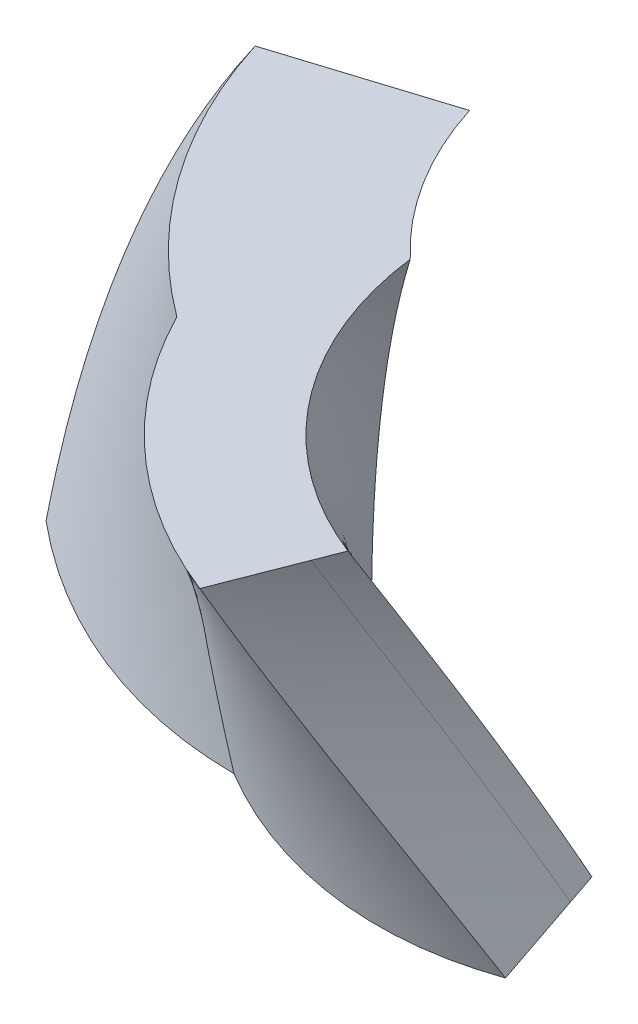
ISO-10303-21;
HEADER;
FILE_DESCRIPTION(('STEP AP214'),'2;1');
FILE_NAME('part.step','',(''),(''),'','','');
FILE_SCHEMA(('AUTOMOTIVE_DESIGN { 1 0 10303 214 1 1 1 1 }'));
ENDSEC;
DATA;
#1=APPLICATION_CONTEXT('core data for automotive mechanical design processes');
#2=APPLICATION_PROTOCOL_DEFINITION('international standard','automotive_design',2000,#1);
#3=PRODUCT_CONTEXT('',#1,'mechanical');
#4=PRODUCT('Part','Part','',(#3));
#5=PRODUCT_RELATED_PRODUCT_CATEGORY('part','',(#4));
#6=PRODUCT_DEFINITION_FORMATION('','',#4);
#7=PRODUCT_DEFINITION_CONTEXT('part definition',#1,'design');
#8=PRODUCT_DEFINITION('design','',#6,#7);
#9=PRODUCT_DEFINITION_SHAPE('','',#8);
#10=(LENGTH_UNIT() NAMED_UNIT(*) SI_UNIT(.MILLI.,.METRE.));
#11=(NAMED_UNIT(*) PLANE_ANGLE_UNIT() SI_UNIT($,.RADIAN.));
#12=(NAMED_UNIT(*) SI_UNIT($,.STERADIAN.) SOLID_ANGLE_UNIT());
#13=UNCERTAINTY_MEASURE_WITH_UNIT(LENGTH_MEASURE(1.E-05),#10,'distance_accuracy_value','');
#14=(GEOMETRIC_REPRESENTATION_CONTEXT(3) GLOBAL_UNCERTAINTY_ASSIGNED_CONTEXT((#13)) GLOBAL_UNIT_ASSIGNED_CONTEXT((#10,
#11,#12)) REPRESENTATION_CONTEXT('',''));
#15=CARTESIAN_POINT('',(0.,0.,0.));
#16=DIRECTION('',(0.,0.,1.));
#17=DIRECTION('',(1.,0.,0.));
#18=AXIS2_PLACEMENT_3D('',#15,#16,#17);
#19=CARTESIAN_POINT('',(15.,93.832,-10.));
#20=DIRECTION('',(0.,1.,0.));
#21=DIRECTION('',(0.,0.,1.));
#22=AXIS2_PLACEMENT_3D('',#19,#20,#21);
#23=PLANE('',#22);
#24=CARTESIAN_POINT('',(15.,93.832,-10.));
#25=DIRECTION('',(0.,-1.,0.));
#26=DIRECTION('',(0.,0.,1.));
#27=AXIS2_PLACEMENT_3D('',#24,#25,#26);
#28=CIRCLE('',#27,104.5);
#29=CARTESIAN_POINT('',(-56.8358537725828,93.832,65.8937422503601));
#30=VERTEX_POINT('',#29);
#31=CARTESIAN_POINT('',(-84.6707772418455,93.832,21.4004166215421));
#32=VERTEX_POINT('',#31);
#33=EDGE_CURVE('E84',#30,#32,#28,.T.);
#34=ORIENTED_EDGE('',*,*,#33,.T.);
#35=DIRECTION('',(-0.953787342027228,0.,0.30048245570854));
#36=VECTOR('',#35,1.);
#37=CARTESIAN_POINT('',(-92.3010759780632,93.832,23.8042762672104));
#38=LINE('',#37,#36);
#39=CARTESIAN_POINT('',(-92.3010759780632,93.832,23.8042762672104));
#40=VERTEX_POINT('',#39);
#41=EDGE_CURVE('E79',#32,#40,#38,.T.);
#42=ORIENTED_EDGE('',*,*,#41,.T.);
#43=DIRECTION('',(-0.953787342027229,0.,0.300482455708537));
#44=VECTOR('',#43,1.);
#45=CARTESIAN_POINT('',(-130.452569659153,93.832,35.823574495552));
#46=LINE('',#45,#44);
#47=CARTESIAN_POINT('',(-130.452569659153,93.832,35.8235744955519));
#48=VERTEX_POINT('',#47);
#49=EDGE_CURVE('E73',#40,#48,#46,.T.);
#50=ORIENTED_EDGE('',*,*,#49,.T.);
#51=CARTESIAN_POINT('',(15.,93.832,-10.));
#52=DIRECTION('',(0.,1.,0.));
#53=DIRECTION('',(0.,0.,1.));
#54=AXIS2_PLACEMENT_3D('',#51,#52,#53);
#55=CIRCLE('',#54,152.5);
#56=CARTESIAN_POINT('',(-75.5466634875456,93.832,112.709216162737));
#57=VERTEX_POINT('',#56);
#58=EDGE_CURVE('E114',#48,#57,#55,.T.);
#59=ORIENTED_EDGE('',*,*,#58,.T.);
#60=CARTESIAN_POINT('',(41.3342929723728,93.832,53.4084346384661));
#61=DIRECTION('',(0.,1.,0.));
#62=DIRECTION('',(0.,0.,1.));
#63=AXIS2_PLACEMENT_3D('',#60,#61,#62);
#64=CIRCLE('',#63,131.06388012101);
#65=CARTESIAN_POINT('',(-6.27577924360034,93.832,175.519129075786));
#66=VERTEX_POINT('',#65);
#67=EDGE_CURVE('E120',#57,#66,#64,.T.);
#68=ORIENTED_EDGE('',*,*,#67,.T.);
#69=DIRECTION('',(0.363258528375743,0.,-0.931688382219232));
#70=VECTOR('',#69,1.);
#71=CARTESIAN_POINT('',(2.47983221247586,93.832,153.062666706335));
#72=LINE('',#71,#70);
#73=CARTESIAN_POINT('',(2.47983221247586,93.832,153.062666706335));
#74=VERTEX_POINT('',#73);
#75=EDGE_CURVE('E131',#66,#74,#72,.T.);
#76=ORIENTED_EDGE('',*,*,#75,.T.);
#77=DIRECTION('',(0.363258528375739,0.,-0.931688382219233));
#78=VECTOR('',#77,1.);
#79=CARTESIAN_POINT('',(2.47983221247586,93.832,153.062666706335));
#80=LINE('',#79,#78);
#81=CARTESIAN_POINT('',(5.38590043948178,93.832,145.609159648582));
#82=VERTEX_POINT('',#81);
#83=EDGE_CURVE('E136',#74,#82,#80,.T.);
#84=ORIENTED_EDGE('',*,*,#83,.T.);
#85=CARTESIAN_POINT('',(41.3342929723728,93.832,53.4084346384661));
#86=DIRECTION('',(0.,-1.,0.));
#87=DIRECTION('',(0.,0.,1.));
#88=AXIS2_PLACEMENT_3D('',#85,#86,#87);
#89=CIRCLE('',#88,98.9609044930863);
#90=EDGE_CURVE('E150',#82,#30,#89,.T.);
#91=ORIENTED_EDGE('',*,*,#90,.T.);
#92=EDGE_LOOP('',(#34,#42,#50,#59,#68,#76,#84,#91));
#93=FACE_BOUND('',#92,.T.);
#94=ADVANCED_FACE('F33',(#93),#23,.T.);
#95=CARTESIAN_POINT('',(-67.1143274405649,6.21041393734663,-52.390613322698));
#96=DIRECTION('',(-0.0800355249672702,0.976018602629879,0.202440119698721));
#97=DIRECTION('',(0.545822895527287,-0.12702519324694,0.828216135437355));
#98=AXIS2_PLACEMENT_3D('',#95,#96,#97);
#99=PLANE('',#98);
#100=CARTESIAN_POINT('',(-67.1143274405649,6.21041393734663,-52.390613322698));
#101=DIRECTION('',(0.0800355249672702,-0.976018602629879,-0.202440119698721));
#102=DIRECTION('',(0.545822895527287,-0.12702519324694,0.828216135437355));
#103=AXIS2_PLACEMENT_3D('',#100,#101,#102);
#104=CIRCLE('',#103,104.5);
#105=CARTESIAN_POINT('',(-85.605869192555,-16.1293729639002,48.0048387896427));
#106=VERTEX_POINT('',#105);
#107=CARTESIAN_POINT('',(-133.107601558439,-15.3983455597949,25.7003546838378));
#108=VERTEX_POINT('',#107);
#109=EDGE_CURVE('E60',#106,#108,#104,.T.);
#110=ORIENTED_EDGE('',*,*,#109,.F.);
#111=CARTESIAN_POINT('',(-10.5399254097179,2.81140494653137,-13.6361510971963));
#112=DIRECTION('',(0.0800355249672702,-0.976018602629879,-0.202440119698721));
#113=DIRECTION('',(0.545822895527287,-0.12702519324694,0.828216135437355));
#114=AXIS2_PLACEMENT_3D('',#111,#112,#113);
#115=CIRCLE('',#114,98.9609044930863);
#116=CARTESIAN_POINT('',(9.80188887320459,-15.2554805916618,81.511412490731));
#117=VERTEX_POINT('',#116);
#118=EDGE_CURVE('E157',#117,#106,#115,.T.);
#119=ORIENTED_EDGE('',*,*,#118,.F.);
#120=DIRECTION('',(-0.205554045682192,0.18256588933517,-0.961466187837587));
#121=VECTOR('',#120,1.);
#122=CARTESIAN_POINT('',(11.4463212386621,-16.7160077063432,89.2031419934317));
#123=LINE('',#122,#121);
#124=CARTESIAN_POINT('',(11.4463212386621,-16.7160077063432,89.2031419934317));
#125=VERTEX_POINT('',#124);
#126=EDGE_CURVE('E144',#125,#117,#123,.T.);
#127=ORIENTED_EDGE('',*,*,#126,.F.);
#128=DIRECTION('',(-0.205554045682188,0.182565889335171,-0.961466187837588));
#129=VECTOR('',#128,1.);
#130=CARTESIAN_POINT('',(11.4463212386621,-16.7160077063432,89.2031419934317));
#131=LINE('',#130,#129);
#132=CARTESIAN_POINT('',(16.400785391961,-21.1163888874791,112.377338085954));
#133=VERTEX_POINT('',#132);
#134=EDGE_CURVE('E137',#133,#125,#131,.T.);
#135=ORIENTED_EDGE('',*,*,#134,.F.);
#136=CARTESIAN_POINT('',(-10.5399254097179,2.81140494653137,-13.6361510971963));
#137=DIRECTION('',(-0.0800355249672702,0.976018602629879,0.202440119698721));
#138=DIRECTION('',(0.545822895527287,-0.12702519324694,0.828216135437355));
#139=AXIS2_PLACEMENT_3D('',#136,#137,#138);
#140=CIRCLE('',#139,131.06388012101);
#141=CARTESIAN_POINT('',(-75.6590245727088,-25.3838737548767,96.5558171016026));
#142=VERTEX_POINT('',#141);
#143=EDGE_CURVE('E128',#142,#133,#140,.T.);
#144=ORIENTED_EDGE('',*,*,#143,.F.);
#145=CARTESIAN_POINT('',(-67.1143274405649,6.21041393734663,-52.390613322698));
#146=DIRECTION('',(-0.0800355249672702,0.976018602629879,0.202440119698721));
#147=DIRECTION('',(0.545822895527287,-0.12702519324694,0.828216135437355));
#148=AXIS2_PLACEMENT_3D('',#145,#146,#147);
#149=CIRCLE('',#148,152.5);
#150=CARTESIAN_POINT('',(-163.420301631721,-25.3239001613527,61.5698902275099));
#151=VERTEX_POINT('',#150);
#152=EDGE_CURVE('E125',#151,#142,#149,.T.);
#153=ORIENTED_EDGE('',*,*,#152,.F.);
#154=DIRECTION('',(-0.631514584860041,-0.206782387532455,0.747281990493166));
#155=VECTOR('',#154,1.);
#156=CARTESIAN_POINT('',(-163.420301631721,-25.3239001613527,61.5698902275099));
#157=LINE('',#156,#155);
#158=CARTESIAN_POINT('',(-138.159718237319,-17.0526046600545,31.678610607783));
#159=VERTEX_POINT('',#158);
#160=EDGE_CURVE('E11',#159,#151,#157,.T.);
#161=ORIENTED_EDGE('',*,*,#160,.F.);
#162=DIRECTION('',(-0.631514584860039,-0.206782387532455,0.747281990493168));
#163=VECTOR('',#162,1.);
#164=CARTESIAN_POINT('',(-138.159718237319,-17.0526046600545,31.678610607783));
#165=LINE('',#164,#163);
#166=EDGE_CURVE('E51',#108,#159,#165,.T.);
#167=ORIENTED_EDGE('',*,*,#166,.F.);
#168=EDGE_LOOP('',(#110,#119,#127,#135,#144,#153,#161,#167));
#169=FACE_BOUND('',#168,.T.);
#170=ADVANCED_FACE('F207',(#169),#99,.F.);
#171=CARTESIAN_POINT('',(-130.452569659153,93.832,35.8235744955519));
#172=CARTESIAN_POINT('',(-143.551148696111,75.1371945168151,35.9481958921007));
#173=CARTESIAN_POINT('',(-153.035745121595,55.8733194217404,38.3436839491718));
#174=CARTESIAN_POINT('',(-164.192342749954,16.1565385500877,47.13277572445));
#175=CARTESIAN_POINT('',(-165.862901086405,-4.29412696618367,53.5236503422993));
#176=CARTESIAN_POINT('',(-163.420301631721,-25.3239001613527,61.5698902275099));
#177=CARTESIAN_POINT('',(-120.668773534675,93.832,66.8791676698618));
#178=CARTESIAN_POINT('',(-130.822565716709,74.4522086349976,66.0760792351131));
#179=CARTESIAN_POINT('',(-137.472318225356,54.6457236906955,67.091667558549));
#180=CARTESIAN_POINT('',(-143.439464128487,14.1789249205518,72.3435052442222));
#181=CARTESIAN_POINT('',(-142.756294459333,-6.47981806667522,76.5779670075965));
#182=CARTESIAN_POINT('',(-138.309083363929,-27.5391324363146,82.1779468338196));
#183=CARTESIAN_POINT('',(-101.74632090727,93.832,93.3765886873346));
#184=CARTESIAN_POINT('',(-109.38757528832,74.1087782625727,90.779263495149));
#185=CARTESIAN_POINT('',(-113.770554536219,54.124645167724,89.6255830273564));
#186=CARTESIAN_POINT('',(-115.904009533925,13.6508484479307,89.9884010121613));
#187=CARTESIAN_POINT('',(-113.654391502543,-6.83806309066884,91.5041031963829));
#188=CARTESIAN_POINT('',(-108.063546527157,-27.5598013872797,94.2352934848656));
#189=CARTESIAN_POINT('',(-75.5466634875456,93.832,112.709216162737));
#190=CARTESIAN_POINT('',(-81.3547795254379,74.1406711626788,107.627627140483));
#191=CARTESIAN_POINT('',(-84.2620592346624,54.3613437247953,103.728709493902));
#192=CARTESIAN_POINT('',(-84.2947144593243,14.6242574119514,98.3316879646421));
#193=CARTESIAN_POINT('',(-81.4201041051934,-5.33362134053295,96.8336999093865));
#194=CARTESIAN_POINT('',(-75.6590245727088,-25.3838737548767,96.5558171016026));
#195=(BOUNDED_SURFACE() B_SPLINE_SURFACE(3,3,((#171,#172,#173,#174,#175,#176),(#177,#178,#179,
#180,#181,#182),(#183,#184,#185,#186,#187,#188),(#189,#190,#191,#192,#193,#194)),.UNSPECIFIED.,
.F.,.F.,.F.) B_SPLINE_SURFACE_WITH_KNOTS((4,4),(4,2,4),(0.,1.),(0.,0.5,1.),
.UNSPECIFIED.) GEOMETRIC_REPRESENTATION_ITEM() RATIONAL_B_SPLINE_SURFACE(((1.,1.,1.,1.,1.,1.),
(0.967209118407979,0.967209118407979,0.967209118407979,0.967209118407979,0.967209118407979,
0.967209118407979),(0.967209118407979,0.967209118407979,0.967209118407979,0.967209118407979,
0.967209118407979,0.967209118407979),(1.,1.,1.,1.,1.,1.))) REPRESENTATION_ITEM('') SURFACE());
#196=CARTESIAN_POINT('',(-75.5466634875456,93.832,112.709216162737));
#197=CARTESIAN_POINT('',(-81.3547795254379,74.1406711626788,107.627627140483));
#198=CARTESIAN_POINT('',(-84.2620592346624,54.3613437247953,103.728709493902));
#199=CARTESIAN_POINT('',(-84.2947144593243,14.6242574119514,98.3316879646421));
#200=CARTESIAN_POINT('',(-81.4201041051934,-5.33362134053295,96.8336999093865));
#201=CARTESIAN_POINT('',(-75.6590245727088,-25.3838737548767,96.5558171016026));
#202=B_SPLINE_CURVE_WITH_KNOTS('',3,(#196,#197,#198,#199,#200,#201),.UNSPECIFIED.,.F.,.F.,(4,2,
4),(0.,0.5,1.),.UNSPECIFIED.);
#203=EDGE_CURVE('E117',#57,#142,#202,.T.);
#204=CARTESIAN_POINT('',(-130.452569659153,93.832,35.8235744955519));
#205=CARTESIAN_POINT('',(-143.551148696111,75.1371945168151,35.9481958921007));
#206=CARTESIAN_POINT('',(-153.035745121595,55.8733194217404,38.3436839491718));
#207=CARTESIAN_POINT('',(-164.192342749954,16.1565385500877,47.13277572445));
#208=CARTESIAN_POINT('',(-165.862901086405,-4.29412696618367,53.5236503422993));
#209=CARTESIAN_POINT('',(-163.420301631721,-25.3239001613527,61.5698902275099));
#210=B_SPLINE_CURVE_WITH_KNOTS('',3,(#204,#205,#206,#207,#208,#209),.UNSPECIFIED.,.F.,.F.,(4,2,
4),(0.,0.5,1.),.UNSPECIFIED.);
#211=EDGE_CURVE('E36',#48,#151,#210,.T.);
#212=ORIENTED_EDGE('',*,*,#203,.F.);
#213=ORIENTED_EDGE('',*,*,#58,.F.);
#214=ORIENTED_EDGE('',*,*,#211,.T.);
#215=ORIENTED_EDGE('',*,*,#152,.T.);
#216=EDGE_LOOP('',(#212,#213,#214,#215));
#217=FACE_BOUND('',#216,.T.);
#218=ADVANCED_FACE('F115',(#217),#195,.F.);
#219=CARTESIAN_POINT('',(-75.5466634875456,93.832,112.709216162737));
#220=CARTESIAN_POINT('',(-81.3547795254313,74.1406711627012,107.627627140488));
#221=CARTESIAN_POINT('',(-84.262059234507,54.3613437247953,103.728709493591));
#222=CARTESIAN_POINT('',(-84.2947144594797,14.6242574119514,98.3316879649529));
#223=CARTESIAN_POINT('',(-81.4201041051217,-5.33362134054469,96.8336999090688));
#224=CARTESIAN_POINT('',(-75.6590245727088,-25.3838737548766,96.5558171016025));
#225=CARTESIAN_POINT('',(-60.7971324051579,93.832,141.780322072854));
#226=CARTESIAN_POINT('',(-63.8487150297326,73.6267707169499,135.300162692732));
#227=CARTESIAN_POINT('',(-64.1825950013303,53.4904724118442,129.585103189285));
#228=CARTESIAN_POINT('',(-59.6715067695496,13.385934805614,119.887675435956));
#229=CARTESIAN_POINT('',(-54.8269508072569,-6.58299708000152,115.905941915663));
#230=CARTESIAN_POINT('',(-47.4892175584431,-26.46916780676,112.925361248815));
#231=CARTESIAN_POINT('',(-36.6476468109453,93.832,163.677358665107));
#232=CARTESIAN_POINT('',(-37.622940183215,73.5368496257033,154.907292451859));
#233=CARTESIAN_POINT('',(-36.2059334271451,53.4835467818868,146.601177035564));
#234=CARTESIAN_POINT('',(-29.0049623628021,13.8827202514361,131.357490966506));
#235=CARTESIAN_POINT('',(-23.2215442932548,-5.66604693698787,124.421099252832));
#236=CARTESIAN_POINT('',(-15.3949678774588,-24.9814206031036,118.441121546382));
#237=CARTESIAN_POINT('',(-6.27577924360034,93.832,175.519129075786));
#238=CARTESIAN_POINT('',(-6.12822203479421,73.8827575969352,163.869110591493));
#239=CARTESIAN_POINT('',(-4.01322420719466,54.3414781048207,152.537967855627));
#240=CARTESIAN_POINT('',(3.66983615039759,16.0492470652369,131.231944197342));
#241=CARTESIAN_POINT('',(9.23741284847175,-2.70344747533357,121.258766373367));
#242=CARTESIAN_POINT('',(16.400785391961,-21.1163888874791,112.377338085954));
#243=(BOUNDED_SURFACE() B_SPLINE_SURFACE(3,3,((#219,#220,#221,#222,#223,#224),(#225,#226,#227,
#228,#229,#230),(#231,#232,#233,#234,#235,#236),(#237,#238,#239,#240,#241,#242)),.UNSPECIFIED.,
.F.,.F.,.F.) B_SPLINE_SURFACE_WITH_KNOTS((4,4),(4,2,4),(0.,1.),(0.,0.5,1.),
.UNSPECIFIED.) GEOMETRIC_REPRESENTATION_ITEM() RATIONAL_B_SPLINE_SURFACE(((1.,1.,1.,1.,1.,1.),
(0.956140231554886,0.956140231554886,0.956140231554886,0.956140231554886,0.956140231554886,
0.956140231554886),(0.956140231554886,0.956140231554886,0.956140231554886,0.956140231554886,
0.956140231554886,0.956140231554886),(1.,1.,1.,1.,1.,1.))) REPRESENTATION_ITEM('') SURFACE());
#244=CARTESIAN_POINT('',(-6.27577924360034,93.832,175.519129075786));
#245=CARTESIAN_POINT('',(-6.12822203479421,73.8827575969352,163.869110591493));
#246=CARTESIAN_POINT('',(-4.01322420719466,54.3414781048207,152.537967855627));
#247=CARTESIAN_POINT('',(3.66983615039759,16.0492470652369,131.231944197342));
#248=CARTESIAN_POINT('',(9.23741284847175,-2.70344747533357,121.258766373367));
#249=CARTESIAN_POINT('',(16.400785391961,-21.1163888874791,112.377338085954));
#250=B_SPLINE_CURVE_WITH_KNOTS('',3,(#244,#245,#246,#247,#248,#249),.UNSPECIFIED.,.F.,.F.,(4,2,
4),(0.,0.5,1.),.UNSPECIFIED.);
#251=EDGE_CURVE('E133',#66,#133,#250,.T.);
#252=ORIENTED_EDGE('',*,*,#251,.F.);
#253=ORIENTED_EDGE('',*,*,#67,.F.);
#254=ORIENTED_EDGE('',*,*,#203,.T.);
#255=ORIENTED_EDGE('',*,*,#143,.T.);
#256=EDGE_LOOP('',(#252,#253,#254,#255));
#257=FACE_BOUND('',#256,.T.);
#258=ADVANCED_FACE('F205',(#257),#243,.F.);
#259=CARTESIAN_POINT('',(-6.27577924360028,93.832,175.519129075786));
#260=CARTESIAN_POINT('',(-6.12822203479351,73.8827575968481,163.869110591442));
#261=CARTESIAN_POINT('',(-4.01322420719458,54.3414781049762,152.537967855627));
#262=CARTESIAN_POINT('',(3.66983615039767,16.0492470650815,131.231944197342));
#263=CARTESIAN_POINT('',(9.23741284891082,-2.70344747437036,121.258766371966));
#264=CARTESIAN_POINT('',(16.4007853919611,-21.1163888874791,112.377338085954));
#265=CARTESIAN_POINT('',(2.47983221247586,93.832,153.062666706335));
#266=CARTESIAN_POINT('',(0.498034062912264,74.738986510393,140.582439799789));
#267=CARTESIAN_POINT('',(0.335536198219005,56.0170883028051,128.764233521231));
#268=CARTESIAN_POINT('',(3.37673474474607,19.2147076428568,107.215204582378));
#269=CARTESIAN_POINT('',(6.58042515370112,1.13227340079069,97.4861642908772));
#270=CARTESIAN_POINT('',(11.4463212386621,-16.7160077063432,89.2031419934317));
#271=B_SPLINE_SURFACE_WITH_KNOTS('',1,3,((#259,#260,#261,#262,#263,#264),(#265,#266,#267,#268,
#269,#270)),.UNSPECIFIED.,.F.,.F.,.F.,(2,2),(4,2,4),(0.,1.),(0.,0.5,1.),.UNSPECIFIED.);
#272=CARTESIAN_POINT('',(2.47983221247586,93.832,153.062666706335));
#273=CARTESIAN_POINT('',(0.498034062912264,74.738986510393,140.582439799789));
#274=CARTESIAN_POINT('',(0.335536198219005,56.0170883028051,128.764233521231));
#275=CARTESIAN_POINT('',(3.37673474474607,19.2147076428568,107.215204582378));
#276=CARTESIAN_POINT('',(6.58042515370112,1.13227340079069,97.4861642908772));
#277=CARTESIAN_POINT('',(11.4463212386621,-16.7160077063432,89.2031419934317));
#278=B_SPLINE_CURVE_WITH_KNOTS('',3,(#272,#273,#274,#275,#276,#277),.UNSPECIFIED.,.F.,.F.,(4,2,
4),(0.,0.5,1.),.UNSPECIFIED.);
#279=EDGE_CURVE('E139',#74,#125,#278,.T.);
#280=ORIENTED_EDGE('',*,*,#279,.F.);
#281=ORIENTED_EDGE('',*,*,#75,.F.);
#282=ORIENTED_EDGE('',*,*,#251,.T.);
#283=ORIENTED_EDGE('',*,*,#134,.T.);
#284=EDGE_LOOP('',(#280,#281,#282,#283));
#285=FACE_BOUND('',#284,.T.);
#286=ADVANCED_FACE('F201',(#285),#271,.F.);
#287=CARTESIAN_POINT('',(2.47983221247586,93.832,153.062666706335));
#288=CARTESIAN_POINT('',(0.498034062912264,74.738986510393,140.582439799789));
#289=CARTESIAN_POINT('',(0.335536198219005,56.0170883028051,128.764233521231));
#290=CARTESIAN_POINT('',(3.37673474474607,19.2147076428568,107.215204582378));
#291=CARTESIAN_POINT('',(6.58042515370112,1.13227340079069,97.4861642908772));
#292=CARTESIAN_POINT('',(11.4463212386621,-16.7160077063432,89.2031419934317));
#293=CARTESIAN_POINT('',(5.38590043948178,93.832,145.609159648582));
#294=CARTESIAN_POINT('',(2.69734979860369,75.0231711861889,132.853375734593));
#295=CARTESIAN_POINT('',(1.77892990119684,56.5732387875017,120.873511743972));
#296=CARTESIAN_POINT('',(3.27945168382959,20.2653532153227,99.2438271111136));
#297=CARTESIAN_POINT('',(5.69854121472694,2.40540269846638,89.5958267814221));
#298=CARTESIAN_POINT('',(9.80188887320459,-15.2554805916618,81.511412490731));
#299=B_SPLINE_SURFACE_WITH_KNOTS('',1,3,((#287,#288,#289,#290,#291,#292),(#293,#294,#295,#296,
#297,#298)),.UNSPECIFIED.,.F.,.F.,.F.,(2,2),(4,2,4),(0.,1.),(0.,0.5,1.),.UNSPECIFIED.);
#300=CARTESIAN_POINT('',(5.38590043948178,93.832,145.609159648582));
#301=CARTESIAN_POINT('',(2.69734979860369,75.0231711861889,132.853375734593));
#302=CARTESIAN_POINT('',(1.77892990119684,56.5732387875017,120.873511743972));
#303=CARTESIAN_POINT('',(3.27945168382959,20.2653532153227,99.2438271111136));
#304=CARTESIAN_POINT('',(5.69854121472694,2.40540269846638,89.5958267814221));
#305=CARTESIAN_POINT('',(9.80188887320459,-15.2554805916618,81.511412490731));
#306=B_SPLINE_CURVE_WITH_KNOTS('',3,(#300,#301,#302,#303,#304,#305),.UNSPECIFIED.,.F.,.F.,(4,2,
4),(0.,0.5,1.),.UNSPECIFIED.);
#307=EDGE_CURVE('E152',#82,#117,#306,.T.);
#308=ORIENTED_EDGE('',*,*,#307,.F.);
#309=ORIENTED_EDGE('',*,*,#83,.F.);
#310=ORIENTED_EDGE('',*,*,#279,.T.);
#311=ORIENTED_EDGE('',*,*,#126,.T.);
#312=EDGE_LOOP('',(#308,#309,#310,#311));
#313=FACE_BOUND('',#312,.T.);
#314=ADVANCED_FACE('F211',(#313),#299,.F.);
#315=CARTESIAN_POINT('',(5.38590043948178,93.832,145.609159648582));
#316=CARTESIAN_POINT('',(2.69734979860369,75.0231711861889,132.853375734593));
#317=CARTESIAN_POINT('',(1.77892990119684,56.5732387875017,120.873511743972));
#318=CARTESIAN_POINT('',(3.27945168382959,20.2653532153227,99.2438271111136));
#319=CARTESIAN_POINT('',(5.69854121472694,2.40540269846638,89.5958267814221));
#320=CARTESIAN_POINT('',(9.80188887320459,-15.2554805916618,81.511412490731));
#321=CARTESIAN_POINT('',(-29.2620272264547,93.832,132.100184485429));
#322=CARTESIAN_POINT('',(-33.2314955256612,74.628561225352,122.629824363695));
#323=CARTESIAN_POINT('',(-34.9461960050581,55.5945191760907,114.100879193356));
#324=CARTESIAN_POINT('',(-33.9956369447713,17.7938007445881,99.3870496302855));
#325=CARTESIAN_POINT('',(-31.3302589497599,-0.974212994578713,93.2033785180897));
#326=CARTESIAN_POINT('',(-26.4703935908245,-19.6646707414796,88.4289169956137));
#327=CARTESIAN_POINT('',(-52.144024776917,93.832,102.784907075804));
#328=CARTESIAN_POINT('',(-58.8931768475492,74.9642546535143,95.4842585344147));
#329=CARTESIAN_POINT('',(-63.087765586207,56.074090531696,89.5378940015007));
#330=CARTESIAN_POINT('',(-66.2691940400647,18.1645638087983,80.5775250255604));
#331=CARTESIAN_POINT('',(-65.2555592591206,-0.855350529337325,77.5641380629373));
#332=CARTESIAN_POINT('',(-61.5565160250344,-19.986043923161,76.1069028212845));
#333=CARTESIAN_POINT('',(-56.8358537725828,93.832,65.8937422503601));
#334=CARTESIAN_POINT('',(-67.0830755253374,75.9359829513675,59.0379596228478));
#335=CARTESIAN_POINT('',(-74.7448885177869,57.8773107306204,54.0807405297901));
#336=CARTESIAN_POINT('',(-84.4802525425419,21.2735487720647,48.0961240213525));
#337=CARTESIAN_POINT('',(-86.5524404484148,2.72864018171231,47.0689237642791));
#338=CARTESIAN_POINT('',(-85.605869192555,-16.1293729639002,48.0048387896427));
#339=(BOUNDED_SURFACE() B_SPLINE_SURFACE(3,3,((#315,#316,#317,#318,#319,#320),(#321,#322,#323,
#324,#325,#326),(#327,#328,#329,#330,#331,#332),(#333,#334,#335,#336,#337,#338)),.UNSPECIFIED.,
.F.,.F.,.F.) B_SPLINE_SURFACE_WITH_KNOTS((4,4),(4,2,4),(0.,1.),(0.,0.5,1.),
.UNSPECIFIED.) GEOMETRIC_REPRESENTATION_ITEM() RATIONAL_B_SPLINE_SURFACE(((1.,1.,1.,1.,1.,1.),
(0.906414953135761,0.906414953135761,0.906414953135761,0.906414953135761,0.906414953135761,
0.906414953135761),(0.906414953135761,0.906414953135761,0.906414953135761,0.906414953135761,
0.906414953135761,0.906414953135761),(1.,1.,1.,1.,1.,1.))) REPRESENTATION_ITEM('') SURFACE());
#340=CARTESIAN_POINT('',(-56.8358537725828,93.832,65.8937422503601));
#341=CARTESIAN_POINT('',(-67.0830755253374,75.9359829513675,59.0379596228478));
#342=CARTESIAN_POINT('',(-74.7448885177869,57.8773107306204,54.0807405297901));
#343=CARTESIAN_POINT('',(-84.4802525425419,21.2735487720647,48.0961240213525));
#344=CARTESIAN_POINT('',(-86.5524404484148,2.72864018171231,47.0689237642791));
#345=CARTESIAN_POINT('',(-85.605869192555,-16.1293729639002,48.0048387896427));
#346=B_SPLINE_CURVE_WITH_KNOTS('',3,(#340,#341,#342,#343,#344,#345),.UNSPECIFIED.,.F.,.F.,(4,2,
4),(0.,0.5,1.),.UNSPECIFIED.);
#347=EDGE_CURVE('E163',#30,#106,#346,.T.);
#348=ORIENTED_EDGE('',*,*,#347,.F.);
#349=ORIENTED_EDGE('',*,*,#90,.F.);
#350=ORIENTED_EDGE('',*,*,#307,.T.);
#351=ORIENTED_EDGE('',*,*,#118,.T.);
#352=EDGE_LOOP('',(#348,#349,#350,#351));
#353=FACE_BOUND('',#352,.T.);
#354=ADVANCED_FACE('F214',(#353),#339,.F.);
#355=CARTESIAN_POINT('',(-56.8358537725828,93.832,65.8937422503601));
#356=CARTESIAN_POINT('',(-67.0830755253374,75.9359829513674,59.0379596228478));
#357=CARTESIAN_POINT('',(-74.7448885177869,57.8773107306204,54.0807405297901));
#358=CARTESIAN_POINT('',(-84.4802525425419,21.2735487720647,48.0961240213525));
#359=CARTESIAN_POINT('',(-86.5524404488962,2.72864018168025,47.0689237641197));
#360=CARTESIAN_POINT('',(-85.605869192555,-16.1293729639002,48.0048387896427));
#361=CARTESIAN_POINT('',(-69.8184857028314,93.832,53.6052660035563));
#362=CARTESIAN_POINT('',(-81.2309231812449,75.9993730264158,47.9805026365326));
#363=CARTESIAN_POINT('',(-89.8834997078895,57.9095634259431,44.4239338628802));
#364=CARTESIAN_POINT('',(-101.16042571089,21.0572331019388,41.45101043358));
#365=CARTESIAN_POINT('',(-103.783180163773,2.29542277055703,42.0343056199871));
#366=CARTESIAN_POINT('',(-103.141616261186,-16.8635376629726,44.6116165387141));
#367=CARTESIAN_POINT('',(-79.2993192089929,93.832,38.450425973618));
#368=CARTESIAN_POINT('',(-92.148781605104,76.2263729897796,33.7246344054161));
#369=CARTESIAN_POINT('',(-102.117081590916,58.2743635258668,31.2829131816487));
#370=CARTESIAN_POINT('',(-115.662005993078,21.5063361001713,30.868831773982));
#371=CARTESIAN_POINT('',(-119.236631243504,2.69152467192802,32.8955740053855));
#372=CARTESIAN_POINT('',(-119.321147572365,-16.614542938255,37.0145020547646));
#373=CARTESIAN_POINT('',(-84.6707772418455,93.832,21.4004166215421));
#374=CARTESIAN_POINT('',(-99.1369855547736,76.6024407844972,17.183940457496));
#375=CARTESIAN_POINT('',(-110.661647868076,58.9483328999574,15.499817793903));
#376=CARTESIAN_POINT('',(-127.055662928539,22.5920771030981,17.0277445446322));
#377=CARTESIAN_POINT('',(-131.922436751463,3.89155781064301,20.2383959297319));
#378=CARTESIAN_POINT('',(-133.107601558439,-15.3983455597949,25.7003546838378));
#379=(BOUNDED_SURFACE() B_SPLINE_SURFACE(3,3,((#355,#356,#357,#358,#359,#360),(#361,#362,#363,
#364,#365,#366),(#367,#368,#369,#370,#371,#372),(#373,#374,#375,#376,#377,#378)),.UNSPECIFIED.,
.F.,.F.,.F.) B_SPLINE_SURFACE_WITH_KNOTS((4,4),(4,2,4),(0.,1.),(0.,0.5,1.),
.UNSPECIFIED.) GEOMETRIC_REPRESENTATION_ITEM() RATIONAL_B_SPLINE_SURFACE(((1.,1.,1.,1.,1.,1.),
(0.978638409487702,0.978638409487702,0.978638409487702,0.978638409487702,0.978638409487702,
0.978638409487702),(0.978638409487702,0.978638409487702,0.978638409487702,0.978638409487702,
0.978638409487702,0.978638409487702),(1.,1.,1.,1.,1.,1.))) REPRESENTATION_ITEM('') SURFACE());
#380=CARTESIAN_POINT('',(-84.6707772418455,93.832,21.4004166215421));
#381=CARTESIAN_POINT('',(-99.1369855547736,76.6024407844972,17.183940457496));
#382=CARTESIAN_POINT('',(-110.661647868076,58.9483328999574,15.499817793903));
#383=CARTESIAN_POINT('',(-127.055662928539,22.5920771030981,17.0277445446322));
#384=CARTESIAN_POINT('',(-131.922436751463,3.89155781064301,20.2383959297319));
#385=CARTESIAN_POINT('',(-133.107601558439,-15.3983455597949,25.7003546838378));
#386=B_SPLINE_CURVE_WITH_KNOTS('',3,(#380,#381,#382,#383,#384,#385),.UNSPECIFIED.,.F.,.F.,(4,2,
4),(0.,0.5,1.),.UNSPECIFIED.);
#387=EDGE_CURVE('E166',#32,#108,#386,.T.);
#388=ORIENTED_EDGE('',*,*,#387,.F.);
#389=ORIENTED_EDGE('',*,*,#33,.F.);
#390=ORIENTED_EDGE('',*,*,#347,.T.);
#391=ORIENTED_EDGE('',*,*,#109,.T.);
#392=EDGE_LOOP('',(#388,#389,#390,#391));
#393=FACE_BOUND('',#392,.T.);
#394=ADVANCED_FACE('F215',(#393),#379,.F.);
#395=CARTESIAN_POINT('',(-84.6707772418455,93.832,21.4004166215421));
#396=CARTESIAN_POINT('',(-99.1369855548668,76.6024407843861,17.1839404574688));
#397=CARTESIAN_POINT('',(-110.661647867765,58.9483328999574,15.499817793903));
#398=CARTESIAN_POINT('',(-127.05566292885,22.5920771030981,17.0277445446322));
#399=CARTESIAN_POINT('',(-131.922436751178,3.89155781068784,20.2383959299016));
#400=CARTESIAN_POINT('',(-133.107601558439,-15.3983455597949,25.7003546838378));
#401=CARTESIAN_POINT('',(-92.3010759780632,93.832,23.8042762672104));
#402=CARTESIAN_POINT('',(-106.539341108662,76.3582390387497,20.3113177524711));
#403=CARTESIAN_POINT('',(-117.723997410226,58.4358306537174,19.3071288197552));
#404=CARTESIAN_POINT('',(-133.245109565545,21.5194873441335,22.0452497412943));
#405=CARTESIAN_POINT('',(-137.579182131936,2.52728090993416,25.78593635379));
#406=CARTESIAN_POINT('',(-138.159718237319,-17.0526046600545,31.678610607783));
#407=B_SPLINE_SURFACE_WITH_KNOTS('',1,3,((#395,#396,#397,#398,#399,#400),(#401,#402,#403,#404,
#405,#406)),.UNSPECIFIED.,.F.,.F.,.F.,(2,2),(4,2,4),(0.,1.),(0.,0.5,1.),.UNSPECIFIED.);
#408=CARTESIAN_POINT('',(-92.3010759780632,93.832,23.8042762672104));
#409=CARTESIAN_POINT('',(-106.539341108662,76.3582390387497,20.3113177524711));
#410=CARTESIAN_POINT('',(-117.723997410226,58.4358306537174,19.3071288197552));
#411=CARTESIAN_POINT('',(-133.245109565545,21.5194873441335,22.0452497412943));
#412=CARTESIAN_POINT('',(-137.579182131936,2.52728090993416,25.78593635379));
#413=CARTESIAN_POINT('',(-138.159718237319,-17.0526046600545,31.678610607783));
#414=B_SPLINE_CURVE_WITH_KNOTS('',3,(#408,#409,#410,#411,#412,#413),.UNSPECIFIED.,.F.,.F.,(4,2,
4),(0.,0.5,1.),.UNSPECIFIED.);
#415=EDGE_CURVE('E43',#40,#159,#414,.T.);
#416=ORIENTED_EDGE('',*,*,#415,.F.);
#417=ORIENTED_EDGE('',*,*,#41,.F.);
#418=ORIENTED_EDGE('',*,*,#387,.T.);
#419=ORIENTED_EDGE('',*,*,#166,.T.);
#420=EDGE_LOOP('',(#416,#417,#418,#419));
#421=FACE_BOUND('',#420,.T.);
#422=ADVANCED_FACE('F217',(#421),#407,.F.);
#423=CARTESIAN_POINT('',(-92.3010759780632,93.832,23.8042762672104));
#424=CARTESIAN_POINT('',(-106.539341108667,76.3582390387429,20.3113177524697));
#425=CARTESIAN_POINT('',(-117.723997410226,58.4358306537174,19.3071288198329));
#426=CARTESIAN_POINT('',(-133.245109565545,21.5194873441335,22.0452497412166));
#427=CARTESIAN_POINT('',(-137.579182131938,2.52728090987369,25.7859363536472));
#428=CARTESIAN_POINT('',(-138.159718237319,-17.0526046600545,31.678610607783));
#429=CARTESIAN_POINT('',(-130.452569659153,93.832,35.823574495552));
#430=CARTESIAN_POINT('',(-143.551148696035,75.1371945169249,35.9481958921));
#431=CARTESIAN_POINT('',(-153.035745121906,55.8733194217404,38.3436839491718));
#432=CARTESIAN_POINT('',(-164.192342749643,16.1565385500877,47.13277572445));
#433=CARTESIAN_POINT('',(-165.862901087385,-4.29412696622604,53.5236503424149));
#434=CARTESIAN_POINT('',(-163.420301631721,-25.3239001613527,61.5698902275099));
#435=B_SPLINE_SURFACE_WITH_KNOTS('',1,3,((#423,#424,#425,#426,#427,#428),(#429,#430,#431,#432,
#433,#434)),.UNSPECIFIED.,.F.,.F.,.F.,(2,2),(4,2,4),(0.,1.),(0.,0.5,1.),.UNSPECIFIED.);
#436=ORIENTED_EDGE('',*,*,#160,.T.);
#437=ORIENTED_EDGE('',*,*,#211,.F.);
#438=ORIENTED_EDGE('',*,*,#49,.F.);
#439=ORIENTED_EDGE('',*,*,#415,.T.);
#440=EDGE_LOOP('',(#436,#437,#438,#439));
#441=FACE_BOUND('',#440,.T.);
#442=ADVANCED_FACE('F123',(#441),#435,.F.);
#443=CLOSED_SHELL('',(#94,#170,#218,#258,#286,#314,#354,#394,#422,#442));
#444=MANIFOLD_SOLID_BREP('B2',#443);
#445=ADVANCED_BREP_SHAPE_REPRESENTATION('',(#18,#444),#14);
#446=SHAPE_DEFINITION_REPRESENTATION(#9,#445);
ENDSEC;
END-ISO-10303-21;
